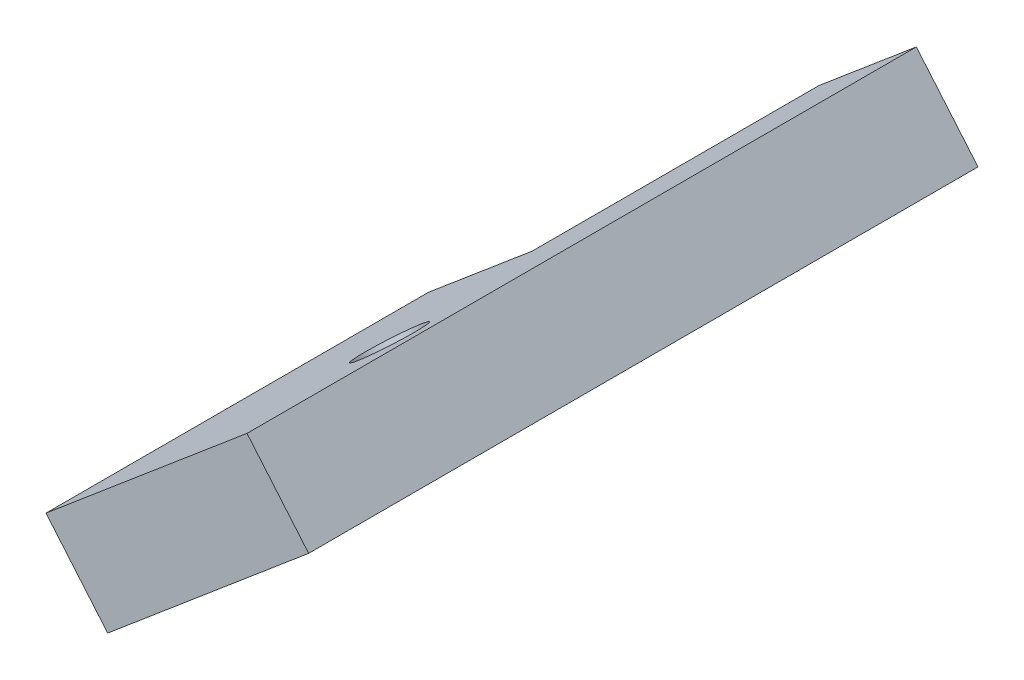
ISO-10303-21;
HEADER;
FILE_DESCRIPTION(('STEP AP214'),'2;1');
FILE_NAME('part.step','',(''),(''),'','','');
FILE_SCHEMA(('AUTOMOTIVE_DESIGN { 1 0 10303 214 1 1 1 1 }'));
ENDSEC;
DATA;
#1=APPLICATION_CONTEXT('core data for automotive mechanical design processes');
#2=APPLICATION_PROTOCOL_DEFINITION('international standard','automotive_design',2000,#1);
#3=PRODUCT_CONTEXT('',#1,'mechanical');
#4=PRODUCT('Part','Part','',(#3));
#5=PRODUCT_RELATED_PRODUCT_CATEGORY('part','',(#4));
#6=PRODUCT_DEFINITION_FORMATION('','',#4);
#7=PRODUCT_DEFINITION_CONTEXT('part definition',#1,'design');
#8=PRODUCT_DEFINITION('design','',#6,#7);
#9=PRODUCT_DEFINITION_SHAPE('','',#8);
#10=(LENGTH_UNIT() NAMED_UNIT(*) SI_UNIT(.MILLI.,.METRE.));
#11=(NAMED_UNIT(*) PLANE_ANGLE_UNIT() SI_UNIT($,.RADIAN.));
#12=(NAMED_UNIT(*) SI_UNIT($,.STERADIAN.) SOLID_ANGLE_UNIT());
#13=UNCERTAINTY_MEASURE_WITH_UNIT(LENGTH_MEASURE(1.E-05),#10,'distance_accuracy_value','');
#14=(GEOMETRIC_REPRESENTATION_CONTEXT(3) GLOBAL_UNCERTAINTY_ASSIGNED_CONTEXT((#13)) GLOBAL_UNIT_ASSIGNED_CONTEXT((#10,
#11,#12)) REPRESENTATION_CONTEXT('',''));
#15=CARTESIAN_POINT('',(0.,0.,0.));
#16=DIRECTION('',(0.,0.,1.));
#17=DIRECTION('',(1.,0.,0.));
#18=AXIS2_PLACEMENT_3D('',#15,#16,#17);
#19=CARTESIAN_POINT('',(891.7440848758,-202.611568956618,-9.));
#20=DIRECTION('',(0.,0.,1.));
#21=DIRECTION('',(1.,0.,0.));
#22=AXIS2_PLACEMENT_3D('',#19,#20,#21);
#23=PLANE('',#22);
#24=DIRECTION('',(0.764342631613293,0.644810314354901,0.));
#25=VECTOR('',#24,1.);
#26=CARTESIAN_POINT('',(877.195607976343,-185.366154496365,-9.));
#27=LINE('',#26,#25);
#28=CARTESIAN_POINT('',(877.195607976343,-185.366154496365,-9.));
#29=VERTEX_POINT('',#28);
#30=CARTESIAN_POINT('',(880.252978502796,-182.786913238945,-9.));
#31=VERTEX_POINT('',#30);
#32=EDGE_CURVE('E94',#29,#31,#27,.T.);
#33=ORIENTED_EDGE('',*,*,#32,.F.);
#34=DIRECTION('',(-0.644810314354913,0.764342631613283,0.));
#35=VECTOR('',#34,1.);
#36=CARTESIAN_POINT('',(891.7440848758,-202.611568956618,-9.));
#37=LINE('',#36,#35);
#38=CARTESIAN_POINT('',(875.261177033256,-183.073126601499,-9.));
#39=VERTEX_POINT('',#38);
#40=EDGE_CURVE('E54',#29,#39,#37,.T.);
#41=ORIENTED_EDGE('',*,*,#40,.T.);
#42=DIRECTION('',(0.764342631613287,0.644810314354908,0.));
#43=VECTOR('',#42,1.);
#44=CARTESIAN_POINT('',(875.261177033256,-183.073126601499,-9.));
#45=LINE('',#44,#43);
#46=CARTESIAN_POINT('',(878.318547559709,-180.493885344079,-9.));
#47=VERTEX_POINT('',#46);
#48=EDGE_CURVE('E97',#39,#47,#45,.T.);
#49=ORIENTED_EDGE('',*,*,#48,.T.);
#50=DIRECTION('',(-0.644810314354913,0.764342631613283,0.));
#51=VECTOR('',#50,1.);
#52=CARTESIAN_POINT('',(894.801455402254,-200.032327699198,-9.));
#53=LINE('',#52,#51);
#54=EDGE_CURVE('E91',#31,#47,#53,.T.);
#55=ORIENTED_EDGE('',*,*,#54,.F.);
#56=EDGE_LOOP('',(#33,#41,#49,#55));
#57=FACE_BOUND('',#56,.T.);
#58=ADVANCED_FACE('F38',(#57),#23,.F.);
#59=CARTESIAN_POINT('',(891.7440848758,-202.611568956618,0.));
#60=DIRECTION('',(0.764342631613283,0.644810314354913,0.));
#61=DIRECTION('',(-0.644810314354913,0.764342631613283,0.));
#62=AXIS2_PLACEMENT_3D('',#59,#60,#61);
#63=PLANE('',#62);
#64=DIRECTION('',(0.,0.,-1.));
#65=VECTOR('',#64,1.);
#66=CARTESIAN_POINT('',(877.195607976343,-185.366154496365,0.));
#67=LINE('',#66,#65);
#68=CARTESIAN_POINT('',(877.195607976343,-185.366154496365,0.));
#69=VERTEX_POINT('',#68);
#70=EDGE_CURVE('E109',#69,#29,#67,.T.);
#71=ORIENTED_EDGE('',*,*,#70,.F.);
#72=DIRECTION('',(-0.644810314354913,0.764342631613283,0.));
#73=VECTOR('',#72,1.);
#74=CARTESIAN_POINT('',(891.7440848758,-202.611568956618,0.));
#75=LINE('',#74,#73);
#76=CARTESIAN_POINT('',(875.261177033256,-183.073126601499,0.));
#77=VERTEX_POINT('',#76);
#78=EDGE_CURVE('E137',#69,#77,#75,.T.);
#79=ORIENTED_EDGE('',*,*,#78,.T.);
#80=DIRECTION('',(0.,0.,-1.));
#81=VECTOR('',#80,1.);
#82=CARTESIAN_POINT('',(875.261177033256,-183.073126601499,0.));
#83=LINE('',#82,#81);
#84=EDGE_CURVE('E133',#77,#39,#83,.T.);
#85=ORIENTED_EDGE('',*,*,#84,.T.);
#86=ORIENTED_EDGE('',*,*,#40,.F.);
#87=EDGE_LOOP('',(#71,#79,#85,#86));
#88=FACE_BOUND('',#87,.T.);
#89=ADVANCED_FACE('F155',(#88),#63,.F.);
#90=CARTESIAN_POINT('',(888.495628691447,-205.352012792625,0.));
#91=DIRECTION('',(0.,0.,1.));
#92=DIRECTION('',(1.,0.,0.));
#93=AXIS2_PLACEMENT_3D('',#90,#91,#92);
#94=PLANE('',#93);
#95=DIRECTION('',(0.764342631613293,0.644810314354901,0.));
#96=VECTOR('',#95,1.);
#97=CARTESIAN_POINT('',(873.947151791989,-188.106598332371,0.));
#98=LINE('',#97,#96);
#99=CARTESIAN_POINT('',(873.947151791989,-188.106598332372,0.));
#100=VERTEX_POINT('',#99);
#101=EDGE_CURVE('E111',#100,#69,#98,.T.);
#102=ORIENTED_EDGE('',*,*,#101,.F.);
#103=DIRECTION('',(-0.644810314354913,0.764342631613283,0.));
#104=VECTOR('',#103,1.);
#105=CARTESIAN_POINT('',(888.495628691447,-205.352012792625,0.));
#106=LINE('',#105,#104);
#107=CARTESIAN_POINT('',(872.012720848902,-185.813570437506,0.));
#108=VERTEX_POINT('',#107);
#109=EDGE_CURVE('E139',#100,#108,#106,.T.);
#110=ORIENTED_EDGE('',*,*,#109,.T.);
#111=DIRECTION('',(0.764342631613278,0.644810314354918,0.));
#112=VECTOR('',#111,1.);
#113=CARTESIAN_POINT('',(872.012720848902,-185.813570437506,0.));
#114=LINE('',#113,#112);
#115=EDGE_CURVE('E130',#108,#77,#114,.T.);
#116=ORIENTED_EDGE('',*,*,#115,.T.);
#117=ORIENTED_EDGE('',*,*,#78,.F.);
#118=EDGE_LOOP('',(#102,#110,#116,#117));
#119=FACE_BOUND('',#118,.T.);
#120=ADVANCED_FACE('F154',(#119),#94,.F.);
#121=CARTESIAN_POINT('',(888.495628691447,-205.352012792625,12.));
#122=DIRECTION('',(0.764342631613283,0.644810314354913,0.));
#123=DIRECTION('',(-0.644810314354913,0.764342631613283,0.));
#124=AXIS2_PLACEMENT_3D('',#121,#122,#123);
#125=PLANE('',#124);
#126=DIRECTION('',(0.,0.,-1.));
#127=VECTOR('',#126,1.);
#128=CARTESIAN_POINT('',(873.947151791989,-188.106598332372,12.));
#129=LINE('',#128,#127);
#130=CARTESIAN_POINT('',(873.947151791989,-188.106598332372,12.));
#131=VERTEX_POINT('',#130);
#132=EDGE_CURVE('E116',#131,#100,#129,.T.);
#133=ORIENTED_EDGE('',*,*,#132,.F.);
#134=DIRECTION('',(-0.644810314354913,0.764342631613283,0.));
#135=VECTOR('',#134,1.);
#136=CARTESIAN_POINT('',(888.495628691447,-205.352012792625,12.));
#137=LINE('',#136,#135);
#138=CARTESIAN_POINT('',(872.012720848902,-185.813570437506,12.));
#139=VERTEX_POINT('',#138);
#140=EDGE_CURVE('E47',#131,#139,#137,.T.);
#141=ORIENTED_EDGE('',*,*,#140,.T.);
#142=DIRECTION('',(0.,0.,-1.));
#143=VECTOR('',#142,1.);
#144=CARTESIAN_POINT('',(872.012720848902,-185.813570437506,12.));
#145=LINE('',#144,#143);
#146=EDGE_CURVE('E127',#139,#108,#145,.T.);
#147=ORIENTED_EDGE('',*,*,#146,.T.);
#148=ORIENTED_EDGE('',*,*,#109,.F.);
#149=EDGE_LOOP('',(#133,#141,#147,#148));
#150=FACE_BOUND('',#149,.T.);
#151=ADVANCED_FACE('F142',(#150),#125,.F.);
#152=CARTESIAN_POINT('',(894.801455402254,-200.032327699198,12.));
#153=DIRECTION('',(0.,0.,-1.));
#154=DIRECTION('',(-1.,0.,0.));
#155=AXIS2_PLACEMENT_3D('',#152,#153,#154);
#156=PLANE('',#155);
#157=DIRECTION('',(-0.764342631613293,-0.644810314354901,0.));
#158=VECTOR('',#157,1.);
#159=CARTESIAN_POINT('',(880.252978502797,-182.786913238945,12.));
#160=LINE('',#159,#158);
#161=CARTESIAN_POINT('',(880.252978502796,-182.786913238945,12.));
#162=VERTEX_POINT('',#161);
#163=EDGE_CURVE('E61',#162,#131,#160,.T.);
#164=ORIENTED_EDGE('',*,*,#163,.F.);
#165=DIRECTION('',(-0.644810314354913,0.764342631613283,0.));
#166=VECTOR('',#165,1.);
#167=CARTESIAN_POINT('',(894.801455402254,-200.032327699198,12.));
#168=LINE('',#167,#166);
#169=CARTESIAN_POINT('',(878.318547559709,-180.493885344079,12.));
#170=VERTEX_POINT('',#169);
#171=EDGE_CURVE('E11',#162,#170,#168,.T.);
#172=ORIENTED_EDGE('',*,*,#171,.T.);
#173=DIRECTION('',(-0.764342631613282,-0.644810314354913,0.));
#174=VECTOR('',#173,1.);
#175=CARTESIAN_POINT('',(878.318547559709,-180.493885344079,12.));
#176=LINE('',#175,#174);
#177=EDGE_CURVE('E124',#170,#139,#176,.T.);
#178=ORIENTED_EDGE('',*,*,#177,.T.);
#179=ORIENTED_EDGE('',*,*,#140,.F.);
#180=EDGE_LOOP('',(#164,#172,#178,#179));
#181=FACE_BOUND('',#180,.T.);
#182=ADVANCED_FACE('F147',(#181),#156,.F.);
#183=CARTESIAN_POINT('',(894.801455402254,-200.032327699198,0.));
#184=DIRECTION('',(-0.764342631613283,-0.644810314354913,0.));
#185=DIRECTION('',(0.644810314354913,-0.764342631613283,0.));
#186=AXIS2_PLACEMENT_3D('',#183,#184,#185);
#187=PLANE('',#186);
#188=DIRECTION('',(0.,0.,1.));
#189=VECTOR('',#188,1.);
#190=CARTESIAN_POINT('',(880.252978502796,-182.786913238945,0.));
#191=LINE('',#190,#189);
#192=EDGE_CURVE('E103',#31,#162,#191,.T.);
#193=ORIENTED_EDGE('',*,*,#192,.F.);
#194=ORIENTED_EDGE('',*,*,#54,.T.);
#195=DIRECTION('',(0.,0.,1.));
#196=VECTOR('',#195,1.);
#197=CARTESIAN_POINT('',(878.318547559709,-180.493885344079,0.));
#198=LINE('',#197,#196);
#199=EDGE_CURVE('E122',#47,#170,#198,.T.);
#200=ORIENTED_EDGE('',*,*,#199,.T.);
#201=ORIENTED_EDGE('',*,*,#171,.F.);
#202=EDGE_LOOP('',(#193,#194,#200,#201));
#203=FACE_BOUND('',#202,.T.);
#204=ADVANCED_FACE('F40',(#203),#187,.F.);
#205=CARTESIAN_POINT('',(454.14508227195,-538.332653169862,0.));
#206=DIRECTION('',(0.644810314354913,-0.764342631613282,0.));
#207=DIRECTION('',(0.764342631613282,0.644810314354913,0.));
#208=AXIS2_PLACEMENT_3D('',#205,#206,#207);
#209=PLANE('',#208);
#210=ORIENTED_EDGE('',*,*,#199,.F.);
#211=ORIENTED_EDGE('',*,*,#48,.F.);
#212=ORIENTED_EDGE('',*,*,#84,.F.);
#213=ORIENTED_EDGE('',*,*,#115,.F.);
#214=ORIENTED_EDGE('',*,*,#146,.F.);
#215=ORIENTED_EDGE('',*,*,#177,.F.);
#216=EDGE_LOOP('',(#210,#211,#212,#213,#214,#215));
#217=FACE_BOUND('',#216,.T.);
#218=CARTESIAN_POINT('',(876.789862296483,-181.783505972789,6.));
#219=DIRECTION('',(0.644810314354913,-0.764342631613283,0.));
#220=DIRECTION('',(0.764342631613283,0.644810314354913,0.));
#221=AXIS2_PLACEMENT_3D('',#218,#219,#220);
#222=CIRCLE('',#221,1.00000000000011);
#223=CARTESIAN_POINT('',(877.554204928096,-181.138695658434,6.));
#224=VERTEX_POINT('',#223);
#225=EDGE_CURVE('E105',#224,#224,#222,.T.);
#226=ORIENTED_EDGE('',*,*,#225,.T.);
#227=EDGE_LOOP('',(#226));
#228=FACE_BOUND('',#227,.T.);
#229=ADVANCED_FACE('F149',(#217,#228),#209,.F.);
#230=CARTESIAN_POINT('',(893.272770139027,-201.321948327908,6.));
#231=DIRECTION('',(-0.644810314354913,0.764342631613283,0.));
#232=DIRECTION('',(-0.764342631613283,-0.644810314354913,0.));
#233=AXIS2_PLACEMENT_3D('',#230,#231,#232);
#234=CYLINDRICAL_SURFACE('',#233,1.00000000000011);
#235=ORIENTED_EDGE('',*,*,#225,.F.);
#236=EDGE_LOOP('',(#235));
#237=FACE_BOUND('',#236,.T.);
#238=CARTESIAN_POINT('',(878.72429323957,-184.076533867655,6.));
#239=DIRECTION('',(0.644810314354901,-0.764342631613293,0.));
#240=DIRECTION('',(0.764342631613293,0.644810314354901,0.));
#241=AXIS2_PLACEMENT_3D('',#238,#239,#240);
#242=CIRCLE('',#241,1.00000000000011);
#243=CARTESIAN_POINT('',(879.488635871183,-183.4317235533,6.));
#244=VERTEX_POINT('',#243);
#245=EDGE_CURVE('E42',#244,#244,#242,.T.);
#246=ORIENTED_EDGE('',*,*,#245,.T.);
#247=EDGE_LOOP('',(#246));
#248=FACE_BOUND('',#247,.T.);
#249=ADVANCED_FACE('F174',(#237,#248),#234,.F.);
#250=CARTESIAN_POINT('',(456.079513215022,-540.625681064728,-9.));
#251=DIRECTION('',(0.644810314354901,-0.764342631613293,0.));
#252=DIRECTION('',(-0.764342631613293,-0.644810314354901,0.));
#253=AXIS2_PLACEMENT_3D('',#250,#251,#252);
#254=PLANE('',#253);
#255=ORIENTED_EDGE('',*,*,#245,.F.);
#256=EDGE_LOOP('',(#255));
#257=FACE_BOUND('',#256,.T.);
#258=ORIENTED_EDGE('',*,*,#32,.T.);
#259=ORIENTED_EDGE('',*,*,#192,.T.);
#260=ORIENTED_EDGE('',*,*,#163,.T.);
#261=ORIENTED_EDGE('',*,*,#132,.T.);
#262=ORIENTED_EDGE('',*,*,#101,.T.);
#263=ORIENTED_EDGE('',*,*,#70,.T.);
#264=EDGE_LOOP('',(#258,#259,#260,#261,#262,#263));
#265=FACE_BOUND('',#264,.T.);
#266=ADVANCED_FACE('F107',(#257,#265),#254,.T.);
#267=CLOSED_SHELL('',(#58,#89,#120,#151,#182,#204,#229,#249,#266));
#268=MANIFOLD_SOLID_BREP('B2',#267);
#269=ADVANCED_BREP_SHAPE_REPRESENTATION('',(#18,#268),#14);
#270=SHAPE_DEFINITION_REPRESENTATION(#9,#269);
ENDSEC;
END-ISO-10303-21;
